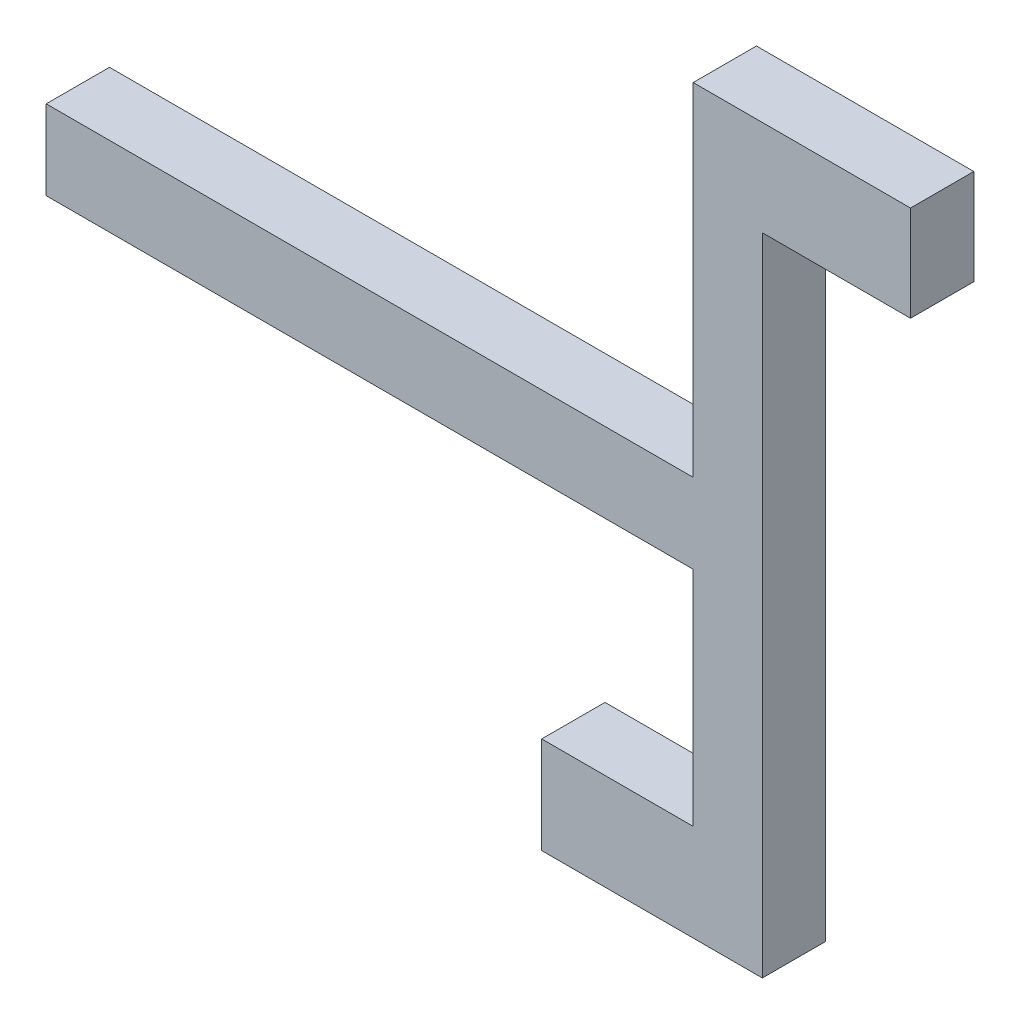
ISO-10303-21;
HEADER;
FILE_DESCRIPTION(('STEP AP214'),'2;1');
FILE_NAME('part.step','',(''),(''),'','','');
FILE_SCHEMA(('AUTOMOTIVE_DESIGN { 1 0 10303 214 1 1 1 1 }'));
ENDSEC;
DATA;
#1=APPLICATION_CONTEXT('core data for automotive mechanical design processes');
#2=APPLICATION_PROTOCOL_DEFINITION('international standard','automotive_design',2000,#1);
#3=PRODUCT_CONTEXT('',#1,'mechanical');
#4=PRODUCT('Part','Part','',(#3));
#5=PRODUCT_RELATED_PRODUCT_CATEGORY('part','',(#4));
#6=PRODUCT_DEFINITION_FORMATION('','',#4);
#7=PRODUCT_DEFINITION_CONTEXT('part definition',#1,'design');
#8=PRODUCT_DEFINITION('design','',#6,#7);
#9=PRODUCT_DEFINITION_SHAPE('','',#8);
#10=(LENGTH_UNIT() NAMED_UNIT(*) SI_UNIT(.MILLI.,.METRE.));
#11=(NAMED_UNIT(*) PLANE_ANGLE_UNIT() SI_UNIT($,.RADIAN.));
#12=(NAMED_UNIT(*) SI_UNIT($,.STERADIAN.) SOLID_ANGLE_UNIT());
#13=UNCERTAINTY_MEASURE_WITH_UNIT(LENGTH_MEASURE(1.E-05),#10,'distance_accuracy_value','');
#14=(GEOMETRIC_REPRESENTATION_CONTEXT(3) GLOBAL_UNCERTAINTY_ASSIGNED_CONTEXT((#13)) GLOBAL_UNIT_ASSIGNED_CONTEXT((#10,
#11,#12)) REPRESENTATION_CONTEXT('',''));
#15=CARTESIAN_POINT('',(0.,0.,0.));
#16=DIRECTION('',(0.,0.,1.));
#17=DIRECTION('',(1.,0.,0.));
#18=AXIS2_PLACEMENT_3D('',#15,#16,#17);
#19=CARTESIAN_POINT('',(275.585716027998,-25.9371640484013,30.));
#20=DIRECTION('',(0.,-1.,0.));
#21=DIRECTION('',(0.,0.,-1.));
#22=AXIS2_PLACEMENT_3D('',#19,#20,#21);
#23=PLANE('',#22);
#24=DIRECTION('',(-1.,0.,0.));
#25=VECTOR('',#24,1.);
#26=CARTESIAN_POINT('',(275.585716027998,-25.9371640484013,0.));
#27=LINE('',#26,#25);
#28=CARTESIAN_POINT('',(275.585716027998,-25.9371640484013,0.));
#29=VERTEX_POINT('',#28);
#30=CARTESIAN_POINT('',(-31.1680488135495,-25.9371640484013,0.));
#31=VERTEX_POINT('',#30);
#32=EDGE_CURVE('E156',#29,#31,#27,.T.);
#33=ORIENTED_EDGE('',*,*,#32,.F.);
#34=DIRECTION('',(0.,0.,-1.));
#35=VECTOR('',#34,1.);
#36=CARTESIAN_POINT('',(275.585716027998,-25.9371640484013,30.));
#37=LINE('',#36,#35);
#38=CARTESIAN_POINT('',(275.585716027998,-25.9371640484013,30.));
#39=VERTEX_POINT('',#38);
#40=EDGE_CURVE('E11',#39,#29,#37,.T.);
#41=ORIENTED_EDGE('',*,*,#40,.F.);
#42=DIRECTION('',(-1.,0.,0.));
#43=VECTOR('',#42,1.);
#44=CARTESIAN_POINT('',(275.585716027998,-25.9371640484013,30.));
#45=LINE('',#44,#43);
#46=CARTESIAN_POINT('',(-31.1680488135495,-25.9371640484013,30.));
#47=VERTEX_POINT('',#46);
#48=EDGE_CURVE('E188',#39,#47,#45,.T.);
#49=ORIENTED_EDGE('',*,*,#48,.T.);
#50=DIRECTION('',(0.,0.,-1.));
#51=VECTOR('',#50,1.);
#52=CARTESIAN_POINT('',(-31.1680488135495,-25.9371640484013,30.));
#53=LINE('',#52,#51);
#54=EDGE_CURVE('E38',#47,#31,#53,.T.);
#55=ORIENTED_EDGE('',*,*,#54,.T.);
#56=EDGE_LOOP('',(#33,#41,#49,#55));
#57=FACE_BOUND('',#56,.T.);
#58=ADVANCED_FACE('F35',(#57),#23,.T.);
#59=CARTESIAN_POINT('',(275.585716027998,-131.520268620216,30.));
#60=DIRECTION('',(-1.,0.,0.));
#61=DIRECTION('',(0.,0.,1.));
#62=AXIS2_PLACEMENT_3D('',#59,#60,#61);
#63=PLANE('',#62);
#64=DIRECTION('',(0.,1.,0.));
#65=VECTOR('',#64,1.);
#66=CARTESIAN_POINT('',(275.585716027998,-131.520268620216,0.));
#67=LINE('',#66,#65);
#68=CARTESIAN_POINT('',(275.585716027998,-131.520268620216,0.));
#69=VERTEX_POINT('',#68);
#70=EDGE_CURVE('E186',#69,#29,#67,.T.);
#71=ORIENTED_EDGE('',*,*,#70,.F.);
#72=DIRECTION('',(0.,0.,-1.));
#73=VECTOR('',#72,1.);
#74=CARTESIAN_POINT('',(275.585716027998,-131.520268620216,30.));
#75=LINE('',#74,#73);
#76=CARTESIAN_POINT('',(275.585716027998,-131.520268620216,30.));
#77=VERTEX_POINT('',#76);
#78=EDGE_CURVE('E44',#77,#69,#75,.T.);
#79=ORIENTED_EDGE('',*,*,#78,.F.);
#80=DIRECTION('',(0.,1.,0.));
#81=VECTOR('',#80,1.);
#82=CARTESIAN_POINT('',(275.585716027998,-131.520268620216,30.));
#83=LINE('',#82,#81);
#84=EDGE_CURVE('E146',#77,#39,#83,.T.);
#85=ORIENTED_EDGE('',*,*,#84,.T.);
#86=ORIENTED_EDGE('',*,*,#40,.T.);
#87=EDGE_LOOP('',(#71,#79,#85,#86));
#88=FACE_BOUND('',#87,.T.);
#89=ADVANCED_FACE('F208',(#88),#63,.T.);
#90=CARTESIAN_POINT('',(203.765272333796,-131.520268620216,30.));
#91=DIRECTION('',(0.,1.,0.));
#92=DIRECTION('',(0.,0.,1.));
#93=AXIS2_PLACEMENT_3D('',#90,#91,#92);
#94=PLANE('',#93);
#95=DIRECTION('',(1.,0.,0.));
#96=VECTOR('',#95,1.);
#97=CARTESIAN_POINT('',(203.765272333796,-131.520268620216,0.));
#98=LINE('',#97,#96);
#99=CARTESIAN_POINT('',(203.765272333796,-131.520268620216,0.));
#100=VERTEX_POINT('',#99);
#101=EDGE_CURVE('E133',#100,#69,#98,.T.);
#102=ORIENTED_EDGE('',*,*,#101,.F.);
#103=DIRECTION('',(0.,0.,-1.));
#104=VECTOR('',#103,1.);
#105=CARTESIAN_POINT('',(203.765272333796,-131.520268620216,30.));
#106=LINE('',#105,#104);
#107=CARTESIAN_POINT('',(203.765272333796,-131.520268620216,30.));
#108=VERTEX_POINT('',#107);
#109=EDGE_CURVE('E128',#108,#100,#106,.T.);
#110=ORIENTED_EDGE('',*,*,#109,.F.);
#111=DIRECTION('',(1.,0.,0.));
#112=VECTOR('',#111,1.);
#113=CARTESIAN_POINT('',(203.765272333796,-131.520268620216,30.));
#114=LINE('',#113,#112);
#115=EDGE_CURVE('E131',#108,#77,#114,.T.);
#116=ORIENTED_EDGE('',*,*,#115,.T.);
#117=ORIENTED_EDGE('',*,*,#78,.T.);
#118=EDGE_LOOP('',(#102,#110,#116,#117));
#119=FACE_BOUND('',#118,.T.);
#120=ADVANCED_FACE('F130',(#119),#94,.T.);
#121=CARTESIAN_POINT('',(203.765272333796,-177.384621403566,30.));
#122=DIRECTION('',(-1.,0.,0.));
#123=DIRECTION('',(0.,0.,1.));
#124=AXIS2_PLACEMENT_3D('',#121,#122,#123);
#125=PLANE('',#124);
#126=DIRECTION('',(0.,1.,0.));
#127=VECTOR('',#126,1.);
#128=CARTESIAN_POINT('',(203.765272333796,-177.384621403566,0.));
#129=LINE('',#128,#127);
#130=CARTESIAN_POINT('',(203.765272333796,-177.384621403566,0.));
#131=VERTEX_POINT('',#130);
#132=EDGE_CURVE('E183',#131,#100,#129,.T.);
#133=ORIENTED_EDGE('',*,*,#132,.F.);
#134=DIRECTION('',(0.,0.,-1.));
#135=VECTOR('',#134,1.);
#136=CARTESIAN_POINT('',(203.765272333796,-177.384621403566,30.));
#137=LINE('',#136,#135);
#138=CARTESIAN_POINT('',(203.765272333796,-177.384621403566,30.));
#139=VERTEX_POINT('',#138);
#140=EDGE_CURVE('E138',#139,#131,#137,.T.);
#141=ORIENTED_EDGE('',*,*,#140,.F.);
#142=DIRECTION('',(0.,1.,0.));
#143=VECTOR('',#142,1.);
#144=CARTESIAN_POINT('',(203.765272333796,-177.384621403566,30.));
#145=LINE('',#144,#143);
#146=EDGE_CURVE('E144',#139,#108,#145,.T.);
#147=ORIENTED_EDGE('',*,*,#146,.T.);
#148=ORIENTED_EDGE('',*,*,#109,.T.);
#149=EDGE_LOOP('',(#133,#141,#147,#148));
#150=FACE_BOUND('',#149,.T.);
#151=ADVANCED_FACE('F148',(#150),#125,.T.);
#152=CARTESIAN_POINT('',(308.373309888394,-177.384621403566,30.));
#153=DIRECTION('',(0.,-1.,0.));
#154=DIRECTION('',(0.,0.,-1.));
#155=AXIS2_PLACEMENT_3D('',#152,#153,#154);
#156=PLANE('',#155);
#157=DIRECTION('',(-1.,0.,0.));
#158=VECTOR('',#157,1.);
#159=CARTESIAN_POINT('',(308.373309888394,-177.384621403566,0.));
#160=LINE('',#159,#158);
#161=CARTESIAN_POINT('',(308.373309888394,-177.384621403566,0.));
#162=VERTEX_POINT('',#161);
#163=EDGE_CURVE('E180',#162,#131,#160,.T.);
#164=ORIENTED_EDGE('',*,*,#163,.F.);
#165=DIRECTION('',(0.,0.,-1.));
#166=VECTOR('',#165,1.);
#167=CARTESIAN_POINT('',(308.373309888394,-177.384621403566,30.));
#168=LINE('',#167,#166);
#169=CARTESIAN_POINT('',(308.373309888394,-177.384621403566,30.));
#170=VERTEX_POINT('',#169);
#171=EDGE_CURVE('E192',#170,#162,#168,.T.);
#172=ORIENTED_EDGE('',*,*,#171,.F.);
#173=DIRECTION('',(-1.,0.,0.));
#174=VECTOR('',#173,1.);
#175=CARTESIAN_POINT('',(308.373309888394,-177.384621403566,30.));
#176=LINE('',#175,#174);
#177=EDGE_CURVE('E149',#170,#139,#176,.T.);
#178=ORIENTED_EDGE('',*,*,#177,.T.);
#179=ORIENTED_EDGE('',*,*,#140,.T.);
#180=EDGE_LOOP('',(#164,#172,#178,#179));
#181=FACE_BOUND('',#180,.T.);
#182=ADVANCED_FACE('F221',(#181),#156,.T.);
#183=CARTESIAN_POINT('',(308.373309888394,128.632921293468,30.));
#184=DIRECTION('',(1.,0.,0.));
#185=DIRECTION('',(0.,0.,-1.));
#186=AXIS2_PLACEMENT_3D('',#183,#184,#185);
#187=PLANE('',#186);
#188=DIRECTION('',(0.,-1.,0.));
#189=VECTOR('',#188,1.);
#190=CARTESIAN_POINT('',(308.373309888394,128.632921293468,0.));
#191=LINE('',#190,#189);
#192=CARTESIAN_POINT('',(308.373309888394,128.632921293468,0.));
#193=VERTEX_POINT('',#192);
#194=EDGE_CURVE('E177',#193,#162,#191,.T.);
#195=ORIENTED_EDGE('',*,*,#194,.F.);
#196=DIRECTION('',(0.,0.,-1.));
#197=VECTOR('',#196,1.);
#198=CARTESIAN_POINT('',(308.373309888394,128.632921293468,30.));
#199=LINE('',#198,#197);
#200=CARTESIAN_POINT('',(308.373309888394,128.632921293468,30.));
#201=VERTEX_POINT('',#200);
#202=EDGE_CURVE('E194',#201,#193,#199,.T.);
#203=ORIENTED_EDGE('',*,*,#202,.F.);
#204=DIRECTION('',(0.,-1.,0.));
#205=VECTOR('',#204,1.);
#206=CARTESIAN_POINT('',(308.373309888394,128.632921293468,30.));
#207=LINE('',#206,#205);
#208=EDGE_CURVE('E151',#201,#170,#207,.T.);
#209=ORIENTED_EDGE('',*,*,#208,.T.);
#210=ORIENTED_EDGE('',*,*,#171,.T.);
#211=EDGE_LOOP('',(#195,#203,#209,#210));
#212=FACE_BOUND('',#211,.T.);
#213=ADVANCED_FACE('F224',(#212),#187,.T.);
#214=CARTESIAN_POINT('',(378.632439589244,128.632921293468,30.));
#215=DIRECTION('',(0.,-1.,0.));
#216=DIRECTION('',(0.,0.,-1.));
#217=AXIS2_PLACEMENT_3D('',#214,#215,#216);
#218=PLANE('',#217);
#219=DIRECTION('',(-1.,0.,0.));
#220=VECTOR('',#219,1.);
#221=CARTESIAN_POINT('',(378.632439589244,128.632921293468,0.));
#222=LINE('',#221,#220);
#223=CARTESIAN_POINT('',(378.632439589244,128.632921293468,0.));
#224=VERTEX_POINT('',#223);
#225=EDGE_CURVE('E174',#224,#193,#222,.T.);
#226=ORIENTED_EDGE('',*,*,#225,.F.);
#227=DIRECTION('',(0.,0.,-1.));
#228=VECTOR('',#227,1.);
#229=CARTESIAN_POINT('',(378.632439589244,128.632921293468,30.));
#230=LINE('',#229,#228);
#231=CARTESIAN_POINT('',(378.632439589244,128.632921293468,30.));
#232=VERTEX_POINT('',#231);
#233=EDGE_CURVE('E196',#232,#224,#230,.T.);
#234=ORIENTED_EDGE('',*,*,#233,.F.);
#235=DIRECTION('',(-1.,0.,0.));
#236=VECTOR('',#235,1.);
#237=CARTESIAN_POINT('',(378.632439589244,128.632921293468,30.));
#238=LINE('',#237,#236);
#239=EDGE_CURVE('E350',#232,#201,#238,.T.);
#240=ORIENTED_EDGE('',*,*,#239,.T.);
#241=ORIENTED_EDGE('',*,*,#202,.T.);
#242=EDGE_LOOP('',(#226,#234,#240,#241));
#243=FACE_BOUND('',#242,.T.);
#244=ADVANCED_FACE('F228',(#243),#218,.T.);
#245=CARTESIAN_POINT('',(378.632439589244,173.911027100683,30.));
#246=DIRECTION('',(1.,0.,0.));
#247=DIRECTION('',(0.,0.,-1.));
#248=AXIS2_PLACEMENT_3D('',#245,#246,#247);
#249=PLANE('',#248);
#250=DIRECTION('',(0.,-1.,0.));
#251=VECTOR('',#250,1.);
#252=CARTESIAN_POINT('',(378.632439589244,173.911027100683,0.));
#253=LINE('',#252,#251);
#254=CARTESIAN_POINT('',(378.632439589244,173.911027100683,0.));
#255=VERTEX_POINT('',#254);
#256=EDGE_CURVE('E171',#255,#224,#253,.T.);
#257=ORIENTED_EDGE('',*,*,#256,.F.);
#258=DIRECTION('',(0.,0.,-1.));
#259=VECTOR('',#258,1.);
#260=CARTESIAN_POINT('',(378.632439589244,173.911027100683,30.));
#261=LINE('',#260,#259);
#262=CARTESIAN_POINT('',(378.632439589244,173.911027100683,30.));
#263=VERTEX_POINT('',#262);
#264=EDGE_CURVE('E198',#263,#255,#261,.T.);
#265=ORIENTED_EDGE('',*,*,#264,.F.);
#266=DIRECTION('',(0.,-1.,0.));
#267=VECTOR('',#266,1.);
#268=CARTESIAN_POINT('',(378.632439589244,173.911027100683,30.));
#269=LINE('',#268,#267);
#270=EDGE_CURVE('E354',#263,#232,#269,.T.);
#271=ORIENTED_EDGE('',*,*,#270,.T.);
#272=ORIENTED_EDGE('',*,*,#233,.T.);
#273=EDGE_LOOP('',(#257,#265,#271,#272));
#274=FACE_BOUND('',#273,.T.);
#275=ADVANCED_FACE('F232',(#274),#249,.T.);
#276=CARTESIAN_POINT('',(275.585716027998,173.911027100683,30.));
#277=DIRECTION('',(0.,1.,0.));
#278=DIRECTION('',(0.,0.,1.));
#279=AXIS2_PLACEMENT_3D('',#276,#277,#278);
#280=PLANE('',#279);
#281=DIRECTION('',(1.,0.,0.));
#282=VECTOR('',#281,1.);
#283=CARTESIAN_POINT('',(275.585716027998,173.911027100683,0.));
#284=LINE('',#283,#282);
#285=CARTESIAN_POINT('',(275.585716027998,173.911027100683,0.));
#286=VERTEX_POINT('',#285);
#287=EDGE_CURVE('E168',#286,#255,#284,.T.);
#288=ORIENTED_EDGE('',*,*,#287,.F.);
#289=DIRECTION('',(0.,0.,-1.));
#290=VECTOR('',#289,1.);
#291=CARTESIAN_POINT('',(275.585716027998,173.911027100683,30.));
#292=LINE('',#291,#290);
#293=CARTESIAN_POINT('',(275.585716027998,173.911027100683,30.));
#294=VERTEX_POINT('',#293);
#295=EDGE_CURVE('E200',#294,#286,#292,.T.);
#296=ORIENTED_EDGE('',*,*,#295,.F.);
#297=DIRECTION('',(1.,0.,0.));
#298=VECTOR('',#297,1.);
#299=CARTESIAN_POINT('',(275.585716027998,173.911027100683,30.));
#300=LINE('',#299,#298);
#301=EDGE_CURVE('E343',#294,#263,#300,.T.);
#302=ORIENTED_EDGE('',*,*,#301,.T.);
#303=ORIENTED_EDGE('',*,*,#264,.T.);
#304=EDGE_LOOP('',(#288,#296,#302,#303));
#305=FACE_BOUND('',#304,.T.);
#306=ADVANCED_FACE('F236',(#305),#280,.T.);
#307=CARTESIAN_POINT('',(275.585716027998,11.7894283621588,30.));
#308=DIRECTION('',(-1.,0.,0.));
#309=DIRECTION('',(0.,0.,1.));
#310=AXIS2_PLACEMENT_3D('',#307,#308,#309);
#311=PLANE('',#310);
#312=DIRECTION('',(0.,1.,0.));
#313=VECTOR('',#312,1.);
#314=CARTESIAN_POINT('',(275.585716027998,11.7894283621588,0.));
#315=LINE('',#314,#313);
#316=CARTESIAN_POINT('',(275.585716027998,11.7894283621588,0.));
#317=VERTEX_POINT('',#316);
#318=EDGE_CURVE('E165',#317,#286,#315,.T.);
#319=ORIENTED_EDGE('',*,*,#318,.F.);
#320=DIRECTION('',(0.,0.,-1.));
#321=VECTOR('',#320,1.);
#322=CARTESIAN_POINT('',(275.585716027998,11.7894283621588,30.));
#323=LINE('',#322,#321);
#324=CARTESIAN_POINT('',(275.585716027998,11.7894283621588,30.));
#325=VERTEX_POINT('',#324);
#326=EDGE_CURVE('E202',#325,#317,#323,.T.);
#327=ORIENTED_EDGE('',*,*,#326,.F.);
#328=DIRECTION('',(0.,1.,0.));
#329=VECTOR('',#328,1.);
#330=CARTESIAN_POINT('',(275.585716027998,11.7894283621588,30.));
#331=LINE('',#330,#329);
#332=EDGE_CURVE('E339',#325,#294,#331,.T.);
#333=ORIENTED_EDGE('',*,*,#332,.T.);
#334=ORIENTED_EDGE('',*,*,#295,.T.);
#335=EDGE_LOOP('',(#319,#327,#333,#334));
#336=FACE_BOUND('',#335,.T.);
#337=ADVANCED_FACE('F240',(#336),#311,.T.);
#338=CARTESIAN_POINT('',(-31.1680488135495,11.7894283621588,30.));
#339=DIRECTION('',(0.,1.,0.));
#340=DIRECTION('',(0.,0.,1.));
#341=AXIS2_PLACEMENT_3D('',#338,#339,#340);
#342=PLANE('',#341);
#343=DIRECTION('',(1.,0.,0.));
#344=VECTOR('',#343,1.);
#345=CARTESIAN_POINT('',(-31.1680488135495,11.7894283621588,0.));
#346=LINE('',#345,#344);
#347=CARTESIAN_POINT('',(-31.1680488135495,11.7894283621588,0.));
#348=VERTEX_POINT('',#347);
#349=EDGE_CURVE('E162',#348,#317,#346,.T.);
#350=ORIENTED_EDGE('',*,*,#349,.F.);
#351=DIRECTION('',(0.,0.,-1.));
#352=VECTOR('',#351,1.);
#353=CARTESIAN_POINT('',(-31.1680488135495,11.7894283621588,30.));
#354=LINE('',#353,#352);
#355=CARTESIAN_POINT('',(-31.1680488135495,11.7894283621588,30.));
#356=VERTEX_POINT('',#355);
#357=EDGE_CURVE('E203',#356,#348,#354,.T.);
#358=ORIENTED_EDGE('',*,*,#357,.F.);
#359=DIRECTION('',(1.,0.,0.));
#360=VECTOR('',#359,1.);
#361=CARTESIAN_POINT('',(-31.1680488135495,11.7894283621588,30.));
#362=LINE('',#361,#360);
#363=EDGE_CURVE('E360',#356,#325,#362,.T.);
#364=ORIENTED_EDGE('',*,*,#363,.T.);
#365=ORIENTED_EDGE('',*,*,#326,.T.);
#366=EDGE_LOOP('',(#350,#358,#364,#365));
#367=FACE_BOUND('',#366,.T.);
#368=ADVANCED_FACE('F244',(#367),#342,.T.);
#369=CARTESIAN_POINT('',(-31.1680488135495,-25.9371640484013,30.));
#370=DIRECTION('',(-1.,0.,0.));
#371=DIRECTION('',(0.,0.,1.));
#372=AXIS2_PLACEMENT_3D('',#369,#370,#371);
#373=PLANE('',#372);
#374=DIRECTION('',(0.,1.,0.));
#375=VECTOR('',#374,1.);
#376=CARTESIAN_POINT('',(-31.1680488135495,-25.9371640484013,0.));
#377=LINE('',#376,#375);
#378=EDGE_CURVE('E159',#31,#348,#377,.T.);
#379=ORIENTED_EDGE('',*,*,#378,.F.);
#380=ORIENTED_EDGE('',*,*,#54,.F.);
#381=DIRECTION('',(0.,1.,0.));
#382=VECTOR('',#381,1.);
#383=CARTESIAN_POINT('',(-31.1680488135495,-25.9371640484013,30.));
#384=LINE('',#383,#382);
#385=EDGE_CURVE('E362',#47,#356,#384,.T.);
#386=ORIENTED_EDGE('',*,*,#385,.T.);
#387=ORIENTED_EDGE('',*,*,#357,.T.);
#388=EDGE_LOOP('',(#379,#380,#386,#387));
#389=FACE_BOUND('',#388,.T.);
#390=ADVANCED_FACE('F205',(#389),#373,.T.);
#391=CARTESIAN_POINT('',(0.,0.,30.));
#392=DIRECTION('',(0.,0.,-1.));
#393=DIRECTION('',(-1.,0.,0.));
#394=AXIS2_PLACEMENT_3D('',#391,#392,#393);
#395=PLANE('',#394);
#396=ORIENTED_EDGE('',*,*,#48,.F.);
#397=ORIENTED_EDGE('',*,*,#84,.F.);
#398=ORIENTED_EDGE('',*,*,#115,.F.);
#399=ORIENTED_EDGE('',*,*,#146,.F.);
#400=ORIENTED_EDGE('',*,*,#177,.F.);
#401=ORIENTED_EDGE('',*,*,#208,.F.);
#402=ORIENTED_EDGE('',*,*,#239,.F.);
#403=ORIENTED_EDGE('',*,*,#270,.F.);
#404=ORIENTED_EDGE('',*,*,#301,.F.);
#405=ORIENTED_EDGE('',*,*,#332,.F.);
#406=ORIENTED_EDGE('',*,*,#363,.F.);
#407=ORIENTED_EDGE('',*,*,#385,.F.);
#408=EDGE_LOOP('',(#396,#397,#398,#399,#400,#401,#402,#403,#404,#405,#406,#407));
#409=FACE_BOUND('',#408,.T.);
#410=ADVANCED_FACE('F142',(#409),#395,.F.);
#411=CARTESIAN_POINT('',(0.,0.,0.));
#412=DIRECTION('',(0.,0.,-1.));
#413=DIRECTION('',(-1.,0.,0.));
#414=AXIS2_PLACEMENT_3D('',#411,#412,#413);
#415=PLANE('',#414);
#416=ORIENTED_EDGE('',*,*,#32,.T.);
#417=ORIENTED_EDGE('',*,*,#378,.T.);
#418=ORIENTED_EDGE('',*,*,#349,.T.);
#419=ORIENTED_EDGE('',*,*,#318,.T.);
#420=ORIENTED_EDGE('',*,*,#287,.T.);
#421=ORIENTED_EDGE('',*,*,#256,.T.);
#422=ORIENTED_EDGE('',*,*,#225,.T.);
#423=ORIENTED_EDGE('',*,*,#194,.T.);
#424=ORIENTED_EDGE('',*,*,#163,.T.);
#425=ORIENTED_EDGE('',*,*,#132,.T.);
#426=ORIENTED_EDGE('',*,*,#101,.T.);
#427=ORIENTED_EDGE('',*,*,#70,.T.);
#428=EDGE_LOOP('',(#416,#417,#418,#419,#420,#421,#422,#423,#424,#425,#426,#427));
#429=FACE_BOUND('',#428,.T.);
#430=ADVANCED_FACE('F207',(#429),#415,.T.);
#431=CLOSED_SHELL('',(#58,#89,#120,#151,#182,#213,#244,#275,#306,#337,#368,#390,#410,#430));
#432=MANIFOLD_SOLID_BREP('B2',#431);
#433=ADVANCED_BREP_SHAPE_REPRESENTATION('',(#18,#432),#14);
#434=SHAPE_DEFINITION_REPRESENTATION(#9,#433);
ENDSEC;
END-ISO-10303-21;
